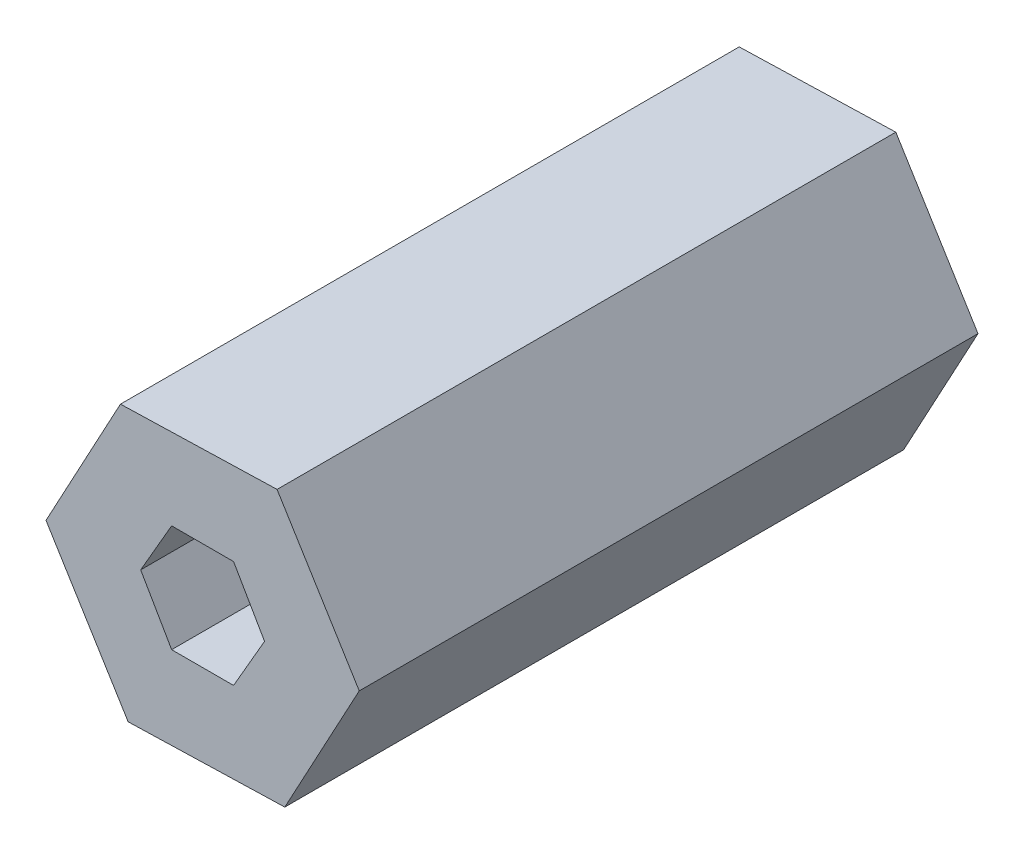
ISO-10303-21;
HEADER;
FILE_DESCRIPTION(('STEP AP214'),'2;1');
FILE_NAME('part.step','',(''),(''),'','','');
FILE_SCHEMA(('AUTOMOTIVE_DESIGN { 1 0 10303 214 1 1 1 1 }'));
ENDSEC;
DATA;
#1=APPLICATION_CONTEXT('core data for automotive mechanical design processes');
#2=APPLICATION_PROTOCOL_DEFINITION('international standard','automotive_design',2000,#1);
#3=PRODUCT_CONTEXT('',#1,'mechanical');
#4=PRODUCT('Part','Part','',(#3));
#5=PRODUCT_RELATED_PRODUCT_CATEGORY('part','',(#4));
#6=PRODUCT_DEFINITION_FORMATION('','',#4);
#7=PRODUCT_DEFINITION_CONTEXT('part definition',#1,'design');
#8=PRODUCT_DEFINITION('design','',#6,#7);
#9=PRODUCT_DEFINITION_SHAPE('','',#8);
#10=(LENGTH_UNIT() NAMED_UNIT(*) SI_UNIT(.MILLI.,.METRE.));
#11=(NAMED_UNIT(*) PLANE_ANGLE_UNIT() SI_UNIT($,.RADIAN.));
#12=(NAMED_UNIT(*) SI_UNIT($,.STERADIAN.) SOLID_ANGLE_UNIT());
#13=UNCERTAINTY_MEASURE_WITH_UNIT(LENGTH_MEASURE(1.E-05),#10,'distance_accuracy_value','');
#14=(GEOMETRIC_REPRESENTATION_CONTEXT(3) GLOBAL_UNCERTAINTY_ASSIGNED_CONTEXT((#13)) GLOBAL_UNIT_ASSIGNED_CONTEXT((#10,
#11,#12)) REPRESENTATION_CONTEXT('',''));
#15=CARTESIAN_POINT('',(0.,0.,0.));
#16=DIRECTION('',(0.,0.,1.));
#17=DIRECTION('',(1.,0.,0.));
#18=AXIS2_PLACEMENT_3D('',#15,#16,#17);
#19=CARTESIAN_POINT('',(2.17372376349894,-1.255,28.956));
#20=DIRECTION('',(-0.866025403784439,0.5,0.));
#21=DIRECTION('',(-0.5,-0.866025403784439,0.));
#22=AXIS2_PLACEMENT_3D('',#19,#20,#21);
#23=PLANE('',#22);
#24=DIRECTION('',(0.5,0.866025403784439,0.));
#25=VECTOR('',#24,1.);
#26=CARTESIAN_POINT('',(2.17372376349894,-1.255,0.));
#27=LINE('',#26,#25);
#28=CARTESIAN_POINT('',(1.44914917566596,-2.51,0.));
#29=VERTEX_POINT('',#28);
#30=CARTESIAN_POINT('',(2.89829835133192,0.,0.));
#31=VERTEX_POINT('',#30);
#32=EDGE_CURVE('E189',#29,#31,#27,.T.);
#33=ORIENTED_EDGE('',*,*,#32,.F.);
#34=DIRECTION('',(0.,0.,-1.));
#35=VECTOR('',#34,1.);
#36=CARTESIAN_POINT('',(1.44914917566596,-2.51,28.956));
#37=LINE('',#36,#35);
#38=CARTESIAN_POINT('',(1.44914917566596,-2.51,28.956));
#39=VERTEX_POINT('',#38);
#40=EDGE_CURVE('E11',#39,#29,#37,.T.);
#41=ORIENTED_EDGE('',*,*,#40,.F.);
#42=DIRECTION('',(0.5,0.866025403784439,0.));
#43=VECTOR('',#42,1.);
#44=CARTESIAN_POINT('',(2.17372376349894,-1.255,28.956));
#45=LINE('',#44,#43);
#46=CARTESIAN_POINT('',(2.89829835133192,0.,28.956));
#47=VERTEX_POINT('',#46);
#48=EDGE_CURVE('E273',#39,#47,#45,.T.);
#49=ORIENTED_EDGE('',*,*,#48,.T.);
#50=DIRECTION('',(0.,0.,-1.));
#51=VECTOR('',#50,1.);
#52=CARTESIAN_POINT('',(2.89829835133192,0.,28.956));
#53=LINE('',#52,#51);
#54=EDGE_CURVE('E59',#47,#31,#53,.T.);
#55=ORIENTED_EDGE('',*,*,#54,.T.);
#56=EDGE_LOOP('',(#33,#41,#49,#55));
#57=FACE_BOUND('',#56,.T.);
#58=ADVANCED_FACE('F39',(#57),#23,.T.);
#59=CARTESIAN_POINT('',(0.,-2.51,28.956));
#60=DIRECTION('',(0.,1.,0.));
#61=DIRECTION('',(0.,0.,1.));
#62=AXIS2_PLACEMENT_3D('',#59,#60,#61);
#63=PLANE('',#62);
#64=DIRECTION('',(1.,0.,0.));
#65=VECTOR('',#64,1.);
#66=CARTESIAN_POINT('',(0.,-2.51,0.));
#67=LINE('',#66,#65);
#68=CARTESIAN_POINT('',(-1.44914917566596,-2.51,0.));
#69=VERTEX_POINT('',#68);
#70=EDGE_CURVE('E192',#69,#29,#67,.T.);
#71=ORIENTED_EDGE('',*,*,#70,.F.);
#72=DIRECTION('',(0.,0.,-1.));
#73=VECTOR('',#72,1.);
#74=CARTESIAN_POINT('',(-1.44914917566596,-2.51,28.956));
#75=LINE('',#74,#73);
#76=CARTESIAN_POINT('',(-1.44914917566596,-2.51,28.956));
#77=VERTEX_POINT('',#76);
#78=EDGE_CURVE('E50',#77,#69,#75,.T.);
#79=ORIENTED_EDGE('',*,*,#78,.F.);
#80=DIRECTION('',(1.,0.,0.));
#81=VECTOR('',#80,1.);
#82=CARTESIAN_POINT('',(0.,-2.51,28.956));
#83=LINE('',#82,#81);
#84=EDGE_CURVE('E276',#77,#39,#83,.T.);
#85=ORIENTED_EDGE('',*,*,#84,.T.);
#86=ORIENTED_EDGE('',*,*,#40,.T.);
#87=EDGE_LOOP('',(#71,#79,#85,#86));
#88=FACE_BOUND('',#87,.T.);
#89=ADVANCED_FACE('F299',(#88),#63,.T.);
#90=CARTESIAN_POINT('',(-2.17372376349894,-1.255,28.956));
#91=DIRECTION('',(0.866025403784439,0.5,0.));
#92=DIRECTION('',(-0.5,0.866025403784439,0.));
#93=AXIS2_PLACEMENT_3D('',#90,#91,#92);
#94=PLANE('',#93);
#95=DIRECTION('',(0.5,-0.866025403784439,0.));
#96=VECTOR('',#95,1.);
#97=CARTESIAN_POINT('',(-2.17372376349894,-1.255,0.));
#98=LINE('',#97,#96);
#99=CARTESIAN_POINT('',(-2.89829835133192,0.,0.));
#100=VERTEX_POINT('',#99);
#101=EDGE_CURVE('E196',#100,#69,#98,.T.);
#102=ORIENTED_EDGE('',*,*,#101,.F.);
#103=DIRECTION('',(0.,0.,-1.));
#104=VECTOR('',#103,1.);
#105=CARTESIAN_POINT('',(-2.89829835133192,0.,28.956));
#106=LINE('',#105,#104);
#107=CARTESIAN_POINT('',(-2.89829835133192,0.,28.956));
#108=VERTEX_POINT('',#107);
#109=EDGE_CURVE('E147',#108,#100,#106,.T.);
#110=ORIENTED_EDGE('',*,*,#109,.F.);
#111=DIRECTION('',(0.5,-0.866025403784439,0.));
#112=VECTOR('',#111,1.);
#113=CARTESIAN_POINT('',(-2.17372376349894,-1.255,28.956));
#114=LINE('',#113,#112);
#115=EDGE_CURVE('E158',#108,#77,#114,.T.);
#116=ORIENTED_EDGE('',*,*,#115,.T.);
#117=ORIENTED_EDGE('',*,*,#78,.T.);
#118=EDGE_LOOP('',(#102,#110,#116,#117));
#119=FACE_BOUND('',#118,.T.);
#120=ADVANCED_FACE('F282',(#119),#94,.T.);
#121=CARTESIAN_POINT('',(-2.17372376349894,1.255,28.956));
#122=DIRECTION('',(0.866025403784439,-0.499999999999999,0.));
#123=DIRECTION('',(0.499999999999999,0.866025403784439,0.));
#124=AXIS2_PLACEMENT_3D('',#121,#122,#123);
#125=PLANE('',#124);
#126=DIRECTION('',(-0.499999999999999,-0.866025403784439,0.));
#127=VECTOR('',#126,1.);
#128=CARTESIAN_POINT('',(-2.17372376349894,1.255,0.));
#129=LINE('',#128,#127);
#130=CARTESIAN_POINT('',(-1.44914917566596,2.51,0.));
#131=VERTEX_POINT('',#130);
#132=EDGE_CURVE('E142',#131,#100,#129,.T.);
#133=ORIENTED_EDGE('',*,*,#132,.F.);
#134=DIRECTION('',(0.,0.,-1.));
#135=VECTOR('',#134,1.);
#136=CARTESIAN_POINT('',(-1.44914917566596,2.51,28.956));
#137=LINE('',#136,#135);
#138=CARTESIAN_POINT('',(-1.44914917566596,2.51,28.956));
#139=VERTEX_POINT('',#138);
#140=EDGE_CURVE('E137',#139,#131,#137,.T.);
#141=ORIENTED_EDGE('',*,*,#140,.F.);
#142=DIRECTION('',(-0.499999999999999,-0.866025403784439,0.));
#143=VECTOR('',#142,1.);
#144=CARTESIAN_POINT('',(-2.17372376349894,1.255,28.956));
#145=LINE('',#144,#143);
#146=EDGE_CURVE('E140',#139,#108,#145,.T.);
#147=ORIENTED_EDGE('',*,*,#146,.T.);
#148=ORIENTED_EDGE('',*,*,#109,.T.);
#149=EDGE_LOOP('',(#133,#141,#147,#148));
#150=FACE_BOUND('',#149,.T.);
#151=ADVANCED_FACE('F139',(#150),#125,.T.);
#152=CARTESIAN_POINT('',(0.,2.51,28.956));
#153=DIRECTION('',(0.,-1.,0.));
#154=DIRECTION('',(1.,0.,0.));
#155=AXIS2_PLACEMENT_3D('',#152,#153,#154);
#156=PLANE('',#155);
#157=DIRECTION('',(-1.,0.,0.));
#158=VECTOR('',#157,1.);
#159=CARTESIAN_POINT('',(0.,2.51,0.));
#160=LINE('',#159,#158);
#161=CARTESIAN_POINT('',(1.44914917566596,2.51,0.));
#162=VERTEX_POINT('',#161);
#163=EDGE_CURVE('E202',#162,#131,#160,.T.);
#164=ORIENTED_EDGE('',*,*,#163,.F.);
#165=DIRECTION('',(0.,0.,-1.));
#166=VECTOR('',#165,1.);
#167=CARTESIAN_POINT('',(1.44914917566596,2.51,28.956));
#168=LINE('',#167,#166);
#169=CARTESIAN_POINT('',(1.44914917566596,2.51,28.956));
#170=VERTEX_POINT('',#169);
#171=EDGE_CURVE('E96',#170,#162,#168,.T.);
#172=ORIENTED_EDGE('',*,*,#171,.F.);
#173=DIRECTION('',(-1.,0.,0.));
#174=VECTOR('',#173,1.);
#175=CARTESIAN_POINT('',(0.,2.51,28.956));
#176=LINE('',#175,#174);
#177=EDGE_CURVE('E155',#170,#139,#176,.T.);
#178=ORIENTED_EDGE('',*,*,#177,.T.);
#179=ORIENTED_EDGE('',*,*,#140,.T.);
#180=EDGE_LOOP('',(#164,#172,#178,#179));
#181=FACE_BOUND('',#180,.T.);
#182=ADVANCED_FACE('F161',(#181),#156,.T.);
#183=CARTESIAN_POINT('',(0.181123048573286,-6.34741635953364,28.956));
#184=DIRECTION('',(-0.0285233147359507,0.999593127485616,0.));
#185=DIRECTION('',(-0.999593127485616,-0.0285233147359507,0.));
#186=AXIS2_PLACEMENT_3D('',#183,#184,#185);
#187=PLANE('',#186);
#188=DIRECTION('',(0.999593127485616,0.0285233147359507,0.));
#189=VECTOR('',#188,1.);
#190=CARTESIAN_POINT('',(0.181123048573286,-6.34741635953364,0.));
#191=LINE('',#190,#189);
#192=CARTESIAN_POINT('',(-3.4835594952621,-6.45198780038387,0.));
#193=VERTEX_POINT('',#192);
#194=CARTESIAN_POINT('',(3.84580559240867,-6.24284491868341,0.));
#195=VERTEX_POINT('',#194);
#196=EDGE_CURVE('E170',#193,#195,#191,.T.);
#197=ORIENTED_EDGE('',*,*,#196,.T.);
#198=DIRECTION('',(0.,0.,-1.));
#199=VECTOR('',#198,1.);
#200=CARTESIAN_POINT('',(3.84580559240867,-6.24284491868341,28.956));
#201=LINE('',#200,#199);
#202=CARTESIAN_POINT('',(3.84580559240867,-6.24284491868341,28.956));
#203=VERTEX_POINT('',#202);
#204=EDGE_CURVE('E43',#203,#195,#201,.T.);
#205=ORIENTED_EDGE('',*,*,#204,.F.);
#206=DIRECTION('',(0.999593127485616,0.0285233147359507,0.));
#207=VECTOR('',#206,1.);
#208=CARTESIAN_POINT('',(0.181123048573286,-6.34741635953364,28.956));
#209=LINE('',#208,#207);
#210=CARTESIAN_POINT('',(-3.4835594952621,-6.45198780038387,28.956));
#211=VERTEX_POINT('',#210);
#212=EDGE_CURVE('E209',#211,#203,#209,.T.);
#213=ORIENTED_EDGE('',*,*,#212,.F.);
#214=DIRECTION('',(0.,0.,-1.));
#215=VECTOR('',#214,1.);
#216=CARTESIAN_POINT('',(-3.4835594952621,-6.45198780038387,28.956));
#217=LINE('',#216,#215);
#218=EDGE_CURVE('E166',#211,#193,#217,.T.);
#219=ORIENTED_EDGE('',*,*,#218,.T.);
#220=EDGE_LOOP('',(#197,#205,#213,#219));
#221=FACE_BOUND('',#220,.T.);
#222=ADVANCED_FACE('F41',(#221),#187,.F.);
#223=CARTESIAN_POINT('',(5.58758534003972,-3.01685101849147,28.956));
#224=DIRECTION('',(-0.879934699218855,0.475094648581335,0.));
#225=DIRECTION('',(-0.475094648581335,-0.879934699218855,0.));
#226=AXIS2_PLACEMENT_3D('',#223,#224,#225);
#227=PLANE('',#226);
#228=DIRECTION('',(0.475094648581335,0.879934699218855,0.));
#229=VECTOR('',#228,1.);
#230=CARTESIAN_POINT('',(5.58758534003972,-3.01685101849147,0.));
#231=LINE('',#230,#229);
#232=CARTESIAN_POINT('',(7.32936508767077,0.209142881700465,0.));
#233=VERTEX_POINT('',#232);
#234=EDGE_CURVE('E174',#195,#233,#231,.T.);
#235=ORIENTED_EDGE('',*,*,#234,.T.);
#236=DIRECTION('',(0.,0.,-1.));
#237=VECTOR('',#236,1.);
#238=CARTESIAN_POINT('',(7.32936508767077,0.209142881700465,28.956));
#239=LINE('',#238,#237);
#240=CARTESIAN_POINT('',(7.32936508767077,0.209142881700465,28.956));
#241=VERTEX_POINT('',#240);
#242=EDGE_CURVE('E232',#241,#233,#239,.T.);
#243=ORIENTED_EDGE('',*,*,#242,.F.);
#244=DIRECTION('',(0.475094648581335,0.879934699218855,0.));
#245=VECTOR('',#244,1.);
#246=CARTESIAN_POINT('',(5.58758534003972,-3.01685101849147,28.956));
#247=LINE('',#246,#245);
#248=EDGE_CURVE('E109',#203,#241,#247,.T.);
#249=ORIENTED_EDGE('',*,*,#248,.F.);
#250=ORIENTED_EDGE('',*,*,#204,.T.);
#251=EDGE_LOOP('',(#235,#243,#249,#250));
#252=FACE_BOUND('',#251,.T.);
#253=ADVANCED_FACE('F240',(#252),#227,.F.);
#254=CARTESIAN_POINT('',(5.40646229146643,3.33056534104217,28.956));
#255=DIRECTION('',(-0.851411384482905,-0.52449847890428,0.));
#256=DIRECTION('',(0.52449847890428,-0.851411384482905,0.));
#257=AXIS2_PLACEMENT_3D('',#254,#255,#256);
#258=PLANE('',#257);
#259=DIRECTION('',(-0.52449847890428,0.851411384482905,0.));
#260=VECTOR('',#259,1.);
#261=CARTESIAN_POINT('',(5.40646229146643,3.33056534104217,0.));
#262=LINE('',#261,#260);
#263=CARTESIAN_POINT('',(3.4835594952621,6.45198780038387,0.));
#264=VERTEX_POINT('',#263);
#265=EDGE_CURVE('E177',#233,#264,#262,.T.);
#266=ORIENTED_EDGE('',*,*,#265,.T.);
#267=DIRECTION('',(0.,0.,-1.));
#268=VECTOR('',#267,1.);
#269=CARTESIAN_POINT('',(3.4835594952621,6.45198780038387,28.956));
#270=LINE('',#269,#268);
#271=CARTESIAN_POINT('',(3.4835594952621,6.45198780038387,28.956));
#272=VERTEX_POINT('',#271);
#273=EDGE_CURVE('E229',#272,#264,#270,.T.);
#274=ORIENTED_EDGE('',*,*,#273,.F.);
#275=DIRECTION('',(-0.52449847890428,0.851411384482905,0.));
#276=VECTOR('',#275,1.);
#277=CARTESIAN_POINT('',(5.40646229146643,3.33056534104217,28.956));
#278=LINE('',#277,#276);
#279=EDGE_CURVE('E262',#241,#272,#278,.T.);
#280=ORIENTED_EDGE('',*,*,#279,.F.);
#281=ORIENTED_EDGE('',*,*,#242,.T.);
#282=EDGE_LOOP('',(#266,#274,#280,#281));
#283=FACE_BOUND('',#282,.T.);
#284=ADVANCED_FACE('F252',(#283),#258,.F.);
#285=CARTESIAN_POINT('',(-0.181123048573286,6.34741635953364,28.956));
#286=DIRECTION('',(0.0285233147359506,-0.999593127485616,0.));
#287=DIRECTION('',(0.999593127485616,0.0285233147359506,0.));
#288=AXIS2_PLACEMENT_3D('',#285,#286,#287);
#289=PLANE('',#288);
#290=DIRECTION('',(-0.999593127485616,-0.0285233147359506,0.));
#291=VECTOR('',#290,1.);
#292=CARTESIAN_POINT('',(-0.181123048573286,6.34741635953364,0.));
#293=LINE('',#292,#291);
#294=CARTESIAN_POINT('',(-3.84580559240867,6.24284491868341,0.));
#295=VERTEX_POINT('',#294);
#296=EDGE_CURVE('E180',#264,#295,#293,.T.);
#297=ORIENTED_EDGE('',*,*,#296,.T.);
#298=DIRECTION('',(0.,0.,-1.));
#299=VECTOR('',#298,1.);
#300=CARTESIAN_POINT('',(-3.84580559240867,6.24284491868341,28.956));
#301=LINE('',#300,#299);
#302=CARTESIAN_POINT('',(-3.84580559240867,6.24284491868341,28.956));
#303=VERTEX_POINT('',#302);
#304=EDGE_CURVE('E225',#303,#295,#301,.T.);
#305=ORIENTED_EDGE('',*,*,#304,.F.);
#306=DIRECTION('',(-0.999593127485616,-0.0285233147359506,0.));
#307=VECTOR('',#306,1.);
#308=CARTESIAN_POINT('',(-0.181123048573286,6.34741635953364,28.956));
#309=LINE('',#308,#307);
#310=EDGE_CURVE('E257',#272,#303,#309,.T.);
#311=ORIENTED_EDGE('',*,*,#310,.F.);
#312=ORIENTED_EDGE('',*,*,#273,.T.);
#313=EDGE_LOOP('',(#297,#305,#311,#312));
#314=FACE_BOUND('',#313,.T.);
#315=ADVANCED_FACE('F255',(#314),#289,.F.);
#316=CARTESIAN_POINT('',(-5.58758534003972,3.01685101849147,28.956));
#317=DIRECTION('',(0.879934699218855,-0.475094648581335,0.));
#318=DIRECTION('',(0.475094648581335,0.879934699218855,0.));
#319=AXIS2_PLACEMENT_3D('',#316,#317,#318);
#320=PLANE('',#319);
#321=DIRECTION('',(-0.475094648581335,-0.879934699218855,0.));
#322=VECTOR('',#321,1.);
#323=CARTESIAN_POINT('',(-5.58758534003972,3.01685101849147,0.));
#324=LINE('',#323,#322);
#325=CARTESIAN_POINT('',(-7.32936508767076,-0.209142881700466,0.));
#326=VERTEX_POINT('',#325);
#327=EDGE_CURVE('E183',#295,#326,#324,.T.);
#328=ORIENTED_EDGE('',*,*,#327,.T.);
#329=DIRECTION('',(0.,0.,-1.));
#330=VECTOR('',#329,1.);
#331=CARTESIAN_POINT('',(-7.32936508767076,-0.209142881700466,28.956));
#332=LINE('',#331,#330);
#333=CARTESIAN_POINT('',(-7.32936508767076,-0.209142881700466,28.956));
#334=VERTEX_POINT('',#333);
#335=EDGE_CURVE('E221',#334,#326,#332,.T.);
#336=ORIENTED_EDGE('',*,*,#335,.F.);
#337=DIRECTION('',(-0.475094648581335,-0.879934699218855,0.));
#338=VECTOR('',#337,1.);
#339=CARTESIAN_POINT('',(-5.58758534003972,3.01685101849147,28.956));
#340=LINE('',#339,#338);
#341=EDGE_CURVE('E261',#303,#334,#340,.T.);
#342=ORIENTED_EDGE('',*,*,#341,.F.);
#343=ORIENTED_EDGE('',*,*,#304,.T.);
#344=EDGE_LOOP('',(#328,#336,#342,#343));
#345=FACE_BOUND('',#344,.T.);
#346=ADVANCED_FACE('F293',(#345),#320,.F.);
#347=CARTESIAN_POINT('',(-5.40646229146643,-3.33056534104217,28.956));
#348=DIRECTION('',(0.851411384482905,0.52449847890428,0.));
#349=DIRECTION('',(-0.52449847890428,0.851411384482905,0.));
#350=AXIS2_PLACEMENT_3D('',#347,#348,#349);
#351=PLANE('',#350);
#352=DIRECTION('',(0.52449847890428,-0.851411384482905,0.));
#353=VECTOR('',#352,1.);
#354=CARTESIAN_POINT('',(-5.40646229146643,-3.33056534104217,0.));
#355=LINE('',#354,#353);
#356=EDGE_CURVE('E186',#326,#193,#355,.T.);
#357=ORIENTED_EDGE('',*,*,#356,.T.);
#358=ORIENTED_EDGE('',*,*,#218,.F.);
#359=DIRECTION('',(0.52449847890428,-0.851411384482905,0.));
#360=VECTOR('',#359,1.);
#361=CARTESIAN_POINT('',(-5.40646229146643,-3.33056534104217,28.956));
#362=LINE('',#361,#360);
#363=EDGE_CURVE('E266',#334,#211,#362,.T.);
#364=ORIENTED_EDGE('',*,*,#363,.F.);
#365=ORIENTED_EDGE('',*,*,#335,.T.);
#366=EDGE_LOOP('',(#357,#358,#364,#365));
#367=FACE_BOUND('',#366,.T.);
#368=ADVANCED_FACE('F286',(#367),#351,.F.);
#369=CARTESIAN_POINT('',(2.17372376349894,1.255,28.956));
#370=DIRECTION('',(-0.866025403784439,-0.5,0.));
#371=DIRECTION('',(0.5,-0.866025403784439,0.));
#372=AXIS2_PLACEMENT_3D('',#369,#370,#371);
#373=PLANE('',#372);
#374=DIRECTION('',(-0.5,0.866025403784439,0.));
#375=VECTOR('',#374,1.);
#376=CARTESIAN_POINT('',(2.17372376349894,1.255,0.));
#377=LINE('',#376,#375);
#378=EDGE_CURVE('E205',#31,#162,#377,.T.);
#379=ORIENTED_EDGE('',*,*,#378,.F.);
#380=ORIENTED_EDGE('',*,*,#54,.F.);
#381=DIRECTION('',(-0.5,0.866025403784439,0.));
#382=VECTOR('',#381,1.);
#383=CARTESIAN_POINT('',(2.17372376349894,1.255,28.956));
#384=LINE('',#383,#382);
#385=EDGE_CURVE('E163',#47,#170,#384,.T.);
#386=ORIENTED_EDGE('',*,*,#385,.T.);
#387=ORIENTED_EDGE('',*,*,#171,.T.);
#388=EDGE_LOOP('',(#379,#380,#386,#387));
#389=FACE_BOUND('',#388,.T.);
#390=ADVANCED_FACE('F284',(#389),#373,.T.);
#391=CARTESIAN_POINT('',(0.,0.,28.956));
#392=DIRECTION('',(0.,0.,1.));
#393=DIRECTION('',(1.,0.,0.));
#394=AXIS2_PLACEMENT_3D('',#391,#392,#393);
#395=PLANE('',#394);
#396=ORIENTED_EDGE('',*,*,#212,.T.);
#397=ORIENTED_EDGE('',*,*,#248,.T.);
#398=ORIENTED_EDGE('',*,*,#279,.T.);
#399=ORIENTED_EDGE('',*,*,#310,.T.);
#400=ORIENTED_EDGE('',*,*,#341,.T.);
#401=ORIENTED_EDGE('',*,*,#363,.T.);
#402=EDGE_LOOP('',(#396,#397,#398,#399,#400,#401));
#403=FACE_BOUND('',#402,.T.);
#404=ORIENTED_EDGE('',*,*,#48,.F.);
#405=ORIENTED_EDGE('',*,*,#84,.F.);
#406=ORIENTED_EDGE('',*,*,#115,.F.);
#407=ORIENTED_EDGE('',*,*,#146,.F.);
#408=ORIENTED_EDGE('',*,*,#177,.F.);
#409=ORIENTED_EDGE('',*,*,#385,.F.);
#410=EDGE_LOOP('',(#404,#405,#406,#407,#408,#409));
#411=FACE_BOUND('',#410,.T.);
#412=ADVANCED_FACE('F153',(#403,#411),#395,.T.);
#413=CARTESIAN_POINT('',(0.,0.,0.));
#414=DIRECTION('',(0.,0.,1.));
#415=DIRECTION('',(1.,0.,0.));
#416=AXIS2_PLACEMENT_3D('',#413,#414,#415);
#417=PLANE('',#416);
#418=ORIENTED_EDGE('',*,*,#196,.F.);
#419=ORIENTED_EDGE('',*,*,#356,.F.);
#420=ORIENTED_EDGE('',*,*,#327,.F.);
#421=ORIENTED_EDGE('',*,*,#296,.F.);
#422=ORIENTED_EDGE('',*,*,#265,.F.);
#423=ORIENTED_EDGE('',*,*,#234,.F.);
#424=EDGE_LOOP('',(#418,#419,#420,#421,#422,#423));
#425=FACE_BOUND('',#424,.T.);
#426=ORIENTED_EDGE('',*,*,#32,.T.);
#427=ORIENTED_EDGE('',*,*,#378,.T.);
#428=ORIENTED_EDGE('',*,*,#163,.T.);
#429=ORIENTED_EDGE('',*,*,#132,.T.);
#430=ORIENTED_EDGE('',*,*,#101,.T.);
#431=ORIENTED_EDGE('',*,*,#70,.T.);
#432=EDGE_LOOP('',(#426,#427,#428,#429,#430,#431));
#433=FACE_BOUND('',#432,.T.);
#434=ADVANCED_FACE('F247',(#425,#433),#417,.F.);
#435=CLOSED_SHELL('',(#58,#89,#120,#151,#182,#222,#253,#284,#315,#346,#368,#390,#412,#434));
#436=MANIFOLD_SOLID_BREP('B2',#435);
#437=ADVANCED_BREP_SHAPE_REPRESENTATION('',(#18,#436),#14);
#438=SHAPE_DEFINITION_REPRESENTATION(#9,#437);
ENDSEC;
END-ISO-10303-21;
